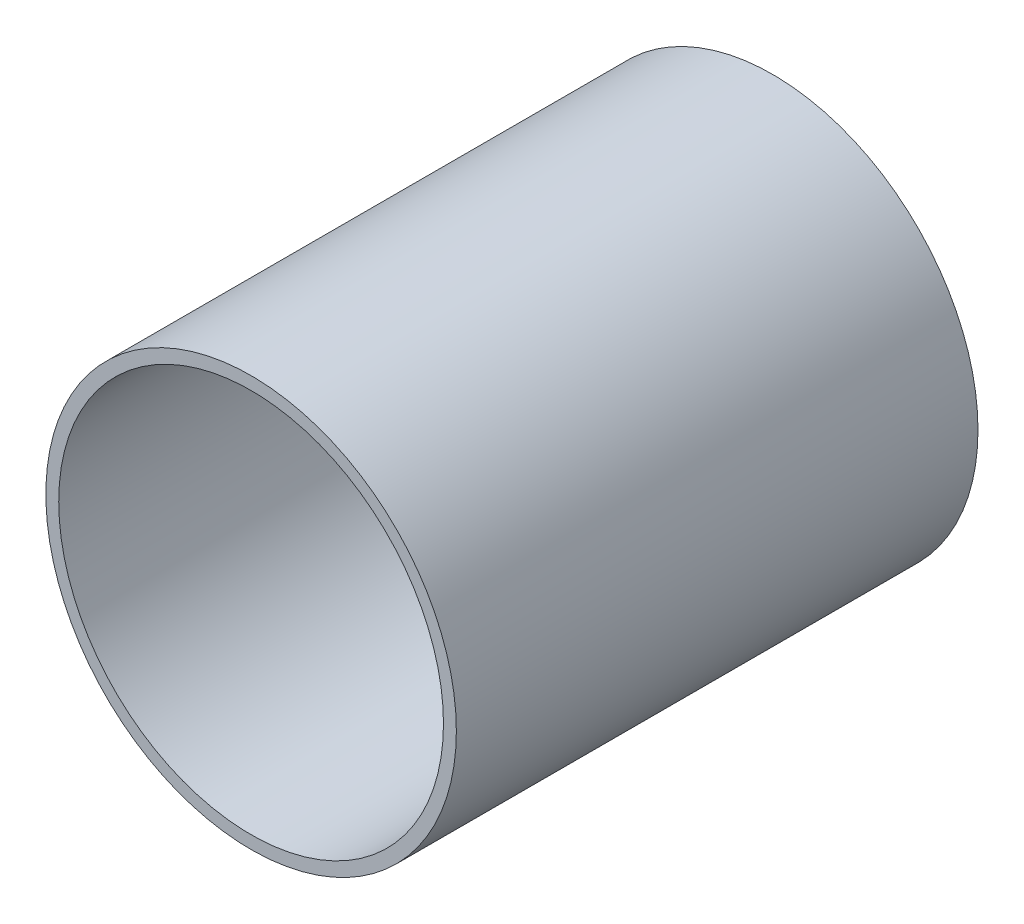
ISO-10303-21;
HEADER;
FILE_DESCRIPTION(('STEP AP214'),'2;1');
FILE_NAME('part.step','',(''),(''),'','','');
FILE_SCHEMA(('AUTOMOTIVE_DESIGN { 1 0 10303 214 1 1 1 1 }'));
ENDSEC;
DATA;
#1=APPLICATION_CONTEXT('core data for automotive mechanical design processes');
#2=APPLICATION_PROTOCOL_DEFINITION('international standard','automotive_design',2000,#1);
#3=PRODUCT_CONTEXT('',#1,'mechanical');
#4=PRODUCT('Part','Part','',(#3));
#5=PRODUCT_RELATED_PRODUCT_CATEGORY('part','',(#4));
#6=PRODUCT_DEFINITION_FORMATION('','',#4);
#7=PRODUCT_DEFINITION_CONTEXT('part definition',#1,'design');
#8=PRODUCT_DEFINITION('design','',#6,#7);
#9=PRODUCT_DEFINITION_SHAPE('','',#8);
#10=(LENGTH_UNIT() NAMED_UNIT(*) SI_UNIT(.MILLI.,.METRE.));
#11=(NAMED_UNIT(*) PLANE_ANGLE_UNIT() SI_UNIT($,.RADIAN.));
#12=(NAMED_UNIT(*) SI_UNIT($,.STERADIAN.) SOLID_ANGLE_UNIT());
#13=UNCERTAINTY_MEASURE_WITH_UNIT(LENGTH_MEASURE(1.E-05),#10,'distance_accuracy_value','');
#14=(GEOMETRIC_REPRESENTATION_CONTEXT(3) GLOBAL_UNCERTAINTY_ASSIGNED_CONTEXT((#13)) GLOBAL_UNIT_ASSIGNED_CONTEXT((#10,
#11,#12)) REPRESENTATION_CONTEXT('',''));
#15=CARTESIAN_POINT('',(0.,0.,0.));
#16=DIRECTION('',(0.,0.,1.));
#17=DIRECTION('',(1.,0.,0.));
#18=AXIS2_PLACEMENT_3D('',#15,#16,#17);
#19=CARTESIAN_POINT('',(0.,0.,40.51));
#20=DIRECTION('',(0.,0.,-1.));
#21=DIRECTION('',(-1.,0.,0.));
#22=AXIS2_PLACEMENT_3D('',#19,#20,#21);
#23=CYLINDRICAL_SURFACE('',#22,31.88);
#24=CARTESIAN_POINT('',(0.,0.,40.51));
#25=DIRECTION('',(0.,0.,1.));
#26=DIRECTION('',(1.,0.,0.));
#27=AXIS2_PLACEMENT_3D('',#24,#25,#26);
#28=CIRCLE('',#27,31.88);
#29=CARTESIAN_POINT('',(31.88,0.,40.51));
#30=VERTEX_POINT('',#29);
#31=EDGE_CURVE('E10',#30,#30,#28,.T.);
#32=ORIENTED_EDGE('',*,*,#31,.F.);
#33=EDGE_LOOP('',(#32));
#34=FACE_BOUND('',#33,.T.);
#35=CARTESIAN_POINT('',(0.,0.,-40.51));
#36=DIRECTION('',(0.,0.,1.));
#37=DIRECTION('',(1.,0.,0.));
#38=AXIS2_PLACEMENT_3D('',#35,#36,#37);
#39=CIRCLE('',#38,31.88);
#40=CARTESIAN_POINT('',(31.88,0.,-40.51));
#41=VERTEX_POINT('',#40);
#42=EDGE_CURVE('E40',#41,#41,#39,.T.);
#43=ORIENTED_EDGE('',*,*,#42,.T.);
#44=EDGE_LOOP('',(#43));
#45=FACE_BOUND('',#44,.T.);
#46=ADVANCED_FACE('F37',(#34,#45),#23,.T.);
#47=CARTESIAN_POINT('',(0.,0.,40.51));
#48=DIRECTION('',(0.,0.,1.));
#49=DIRECTION('',(1.,0.,0.));
#50=AXIS2_PLACEMENT_3D('',#47,#48,#49);
#51=PLANE('',#50);
#52=CARTESIAN_POINT('',(0.,0.,40.51));
#53=DIRECTION('',(0.,0.,-1.));
#54=DIRECTION('',(-1.,0.,0.));
#55=AXIS2_PLACEMENT_3D('',#52,#53,#54);
#56=CIRCLE('',#55,29.88);
#57=CARTESIAN_POINT('',(-29.88,0.,40.51));
#58=VERTEX_POINT('',#57);
#59=EDGE_CURVE('E49',#58,#58,#56,.T.);
#60=ORIENTED_EDGE('',*,*,#59,.T.);
#61=EDGE_LOOP('',(#60));
#62=FACE_BOUND('',#61,.T.);
#63=ORIENTED_EDGE('',*,*,#31,.T.);
#64=EDGE_LOOP('',(#63));
#65=FACE_BOUND('',#64,.T.);
#66=ADVANCED_FACE('F59',(#62,#65),#51,.T.);
#67=CARTESIAN_POINT('',(0.,0.,-40.51));
#68=DIRECTION('',(0.,0.,1.));
#69=DIRECTION('',(1.,0.,0.));
#70=AXIS2_PLACEMENT_3D('',#67,#68,#69);
#71=PLANE('',#70);
#72=CARTESIAN_POINT('',(0.,0.,-40.51));
#73=DIRECTION('',(0.,0.,-1.));
#74=DIRECTION('',(-1.,0.,0.));
#75=AXIS2_PLACEMENT_3D('',#72,#73,#74);
#76=CIRCLE('',#75,29.88);
#77=CARTESIAN_POINT('',(-29.88,0.,-40.51));
#78=VERTEX_POINT('',#77);
#79=EDGE_CURVE('E51',#78,#78,#76,.T.);
#80=ORIENTED_EDGE('',*,*,#79,.F.);
#81=EDGE_LOOP('',(#80));
#82=FACE_BOUND('',#81,.T.);
#83=ORIENTED_EDGE('',*,*,#42,.F.);
#84=EDGE_LOOP('',(#83));
#85=FACE_BOUND('',#84,.T.);
#86=ADVANCED_FACE('F64',(#82,#85),#71,.F.);
#87=CARTESIAN_POINT('',(0.,0.,40.51));
#88=DIRECTION('',(0.,0.,-1.));
#89=DIRECTION('',(-1.,0.,0.));
#90=AXIS2_PLACEMENT_3D('',#87,#88,#89);
#91=CYLINDRICAL_SURFACE('',#90,29.88);
#92=ORIENTED_EDGE('',*,*,#59,.F.);
#93=EDGE_LOOP('',(#92));
#94=FACE_BOUND('',#93,.T.);
#95=ORIENTED_EDGE('',*,*,#79,.T.);
#96=EDGE_LOOP('',(#95));
#97=FACE_BOUND('',#96,.T.);
#98=ADVANCED_FACE('F61',(#94,#97),#91,.F.);
#99=CLOSED_SHELL('',(#46,#66,#86,#98));
#100=MANIFOLD_SOLID_BREP('B2',#99);
#101=ADVANCED_BREP_SHAPE_REPRESENTATION('',(#18,#100),#14);
#102=SHAPE_DEFINITION_REPRESENTATION(#9,#101);
ENDSEC;
END-ISO-10303-21;
